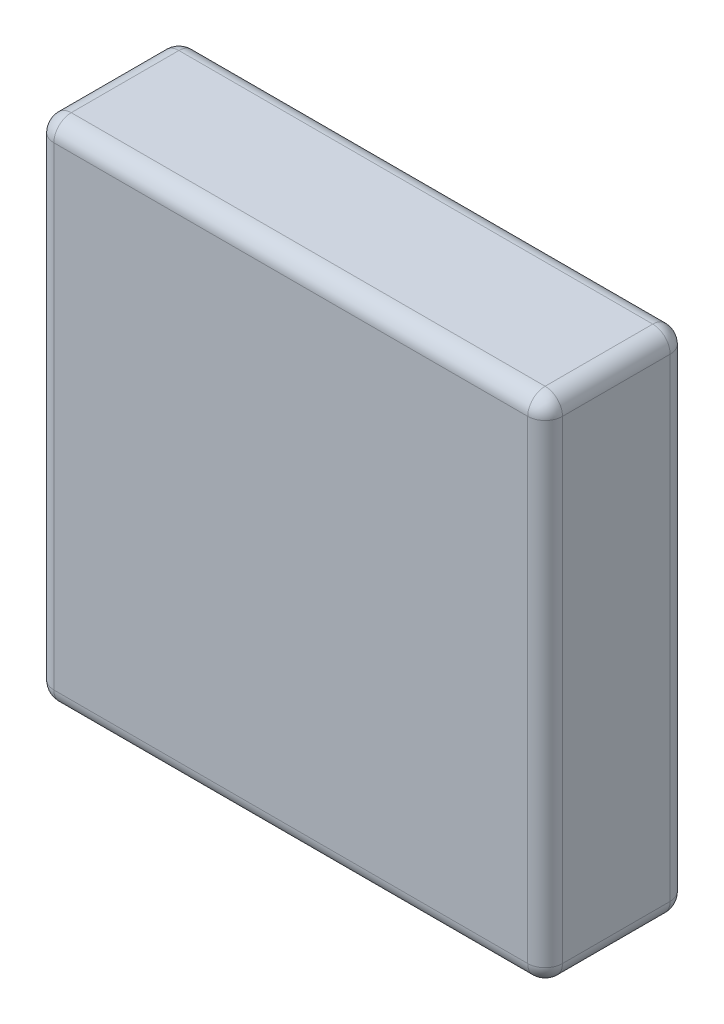
ISO-10303-21;
HEADER;
FILE_DESCRIPTION(('STEP AP214'),'2;1');
FILE_NAME('part.step','',(''),(''),'','','');
FILE_SCHEMA(('AUTOMOTIVE_DESIGN { 1 0 10303 214 1 1 1 1 }'));
ENDSEC;
DATA;
#1=APPLICATION_CONTEXT('core data for automotive mechanical design processes');
#2=APPLICATION_PROTOCOL_DEFINITION('international standard','automotive_design',2000,#1);
#3=PRODUCT_CONTEXT('',#1,'mechanical');
#4=PRODUCT('Part','Part','',(#3));
#5=PRODUCT_RELATED_PRODUCT_CATEGORY('part','',(#4));
#6=PRODUCT_DEFINITION_FORMATION('','',#4);
#7=PRODUCT_DEFINITION_CONTEXT('part definition',#1,'design');
#8=PRODUCT_DEFINITION('design','',#6,#7);
#9=PRODUCT_DEFINITION_SHAPE('','',#8);
#10=(LENGTH_UNIT() NAMED_UNIT(*) SI_UNIT(.MILLI.,.METRE.));
#11=(NAMED_UNIT(*) PLANE_ANGLE_UNIT() SI_UNIT($,.RADIAN.));
#12=(NAMED_UNIT(*) SI_UNIT($,.STERADIAN.) SOLID_ANGLE_UNIT());
#13=UNCERTAINTY_MEASURE_WITH_UNIT(LENGTH_MEASURE(1.E-05),#10,'distance_accuracy_value','');
#14=(GEOMETRIC_REPRESENTATION_CONTEXT(3) GLOBAL_UNCERTAINTY_ASSIGNED_CONTEXT((#13)) GLOBAL_UNIT_ASSIGNED_CONTEXT((#10,
#11,#12)) REPRESENTATION_CONTEXT('',''));
#15=CARTESIAN_POINT('',(0.,0.,0.));
#16=DIRECTION('',(0.,0.,1.));
#17=DIRECTION('',(1.,0.,0.));
#18=AXIS2_PLACEMENT_3D('',#15,#16,#17);
#19=CARTESIAN_POINT('',(5.08,143.51,36.5252));
#20=DIRECTION('',(0.707106781286411,0.707106781086684,0.));
#21=DIRECTION('',(-0.707106781086684,0.707106781286411,0.));
#22=AXIS2_PLACEMENT_3D('',#19,#20,#21);
#23=SPHERICAL_SURFACE('',#22,5.08);
#24=CARTESIAN_POINT('',(5.08,143.51,36.5252));
#25=DIRECTION('',(-1.,0.,0.));
#26=DIRECTION('',(0.,0.,1.));
#27=AXIS2_PLACEMENT_3D('',#24,#25,#26);
#28=CIRCLE('',#27,5.08);
#29=CARTESIAN_POINT('',(5.08,148.59,36.5252));
#30=VERTEX_POINT('',#29);
#31=CARTESIAN_POINT('',(5.08,143.51,41.6052));
#32=VERTEX_POINT('',#31);
#33=EDGE_CURVE('E106',#30,#32,#28,.F.);
#34=ORIENTED_EDGE('',*,*,#33,.F.);
#35=CARTESIAN_POINT('',(5.08,143.51,36.5252));
#36=DIRECTION('',(0.,0.,-1.));
#37=DIRECTION('',(-1.,0.,0.));
#38=AXIS2_PLACEMENT_3D('',#35,#36,#37);
#39=CIRCLE('',#38,5.08);
#40=CARTESIAN_POINT('',(0.,143.51,36.5252));
#41=VERTEX_POINT('',#40);
#42=EDGE_CURVE('E142',#41,#30,#39,.T.);
#43=ORIENTED_EDGE('',*,*,#42,.F.);
#44=CARTESIAN_POINT('',(5.08,143.51,36.5252));
#45=DIRECTION('',(0.,-1.,0.));
#46=DIRECTION('',(0.,0.,-1.));
#47=AXIS2_PLACEMENT_3D('',#44,#45,#46);
#48=CIRCLE('',#47,5.08);
#49=EDGE_CURVE('E110',#32,#41,#48,.T.);
#50=ORIENTED_EDGE('',*,*,#49,.F.);
#51=EDGE_LOOP('',(#34,#43,#50));
#52=FACE_BOUND('',#51,.T.);
#53=ADVANCED_FACE('F17',(#52),#23,.T.);
#54=CARTESIAN_POINT('',(5.08,5.08,36.5252));
#55=DIRECTION('',(-0.707106781086687,0.707106781286408,0.));
#56=DIRECTION('',(-0.707106781286408,-0.707106781086687,0.));
#57=AXIS2_PLACEMENT_3D('',#54,#55,#56);
#58=SPHERICAL_SURFACE('',#57,5.08);
#59=CARTESIAN_POINT('',(5.08,5.08,36.5252));
#60=DIRECTION('',(0.,-1.,0.));
#61=DIRECTION('',(0.,0.,-1.));
#62=AXIS2_PLACEMENT_3D('',#59,#60,#61);
#63=CIRCLE('',#62,5.08);
#64=CARTESIAN_POINT('',(0.,5.08,36.5252));
#65=VERTEX_POINT('',#64);
#66=CARTESIAN_POINT('',(5.08000000000001,5.08,41.6052));
#67=VERTEX_POINT('',#66);
#68=EDGE_CURVE('E136',#65,#67,#63,.F.);
#69=ORIENTED_EDGE('',*,*,#68,.F.);
#70=CARTESIAN_POINT('',(5.08,5.08,36.5252));
#71=DIRECTION('',(0.,0.,-1.));
#72=DIRECTION('',(-1.,0.,0.));
#73=AXIS2_PLACEMENT_3D('',#70,#71,#72);
#74=CIRCLE('',#73,5.08);
#75=CARTESIAN_POINT('',(5.08000000000001,0.,36.5252));
#76=VERTEX_POINT('',#75);
#77=EDGE_CURVE('E174',#76,#65,#74,.T.);
#78=ORIENTED_EDGE('',*,*,#77,.F.);
#79=CARTESIAN_POINT('',(5.08000000000002,5.08,36.5252));
#80=DIRECTION('',(1.,0.,0.));
#81=DIRECTION('',(0.,0.,-1.));
#82=AXIS2_PLACEMENT_3D('',#79,#80,#81);
#83=CIRCLE('',#82,5.08);
#84=EDGE_CURVE('E139',#67,#76,#83,.T.);
#85=ORIENTED_EDGE('',*,*,#84,.F.);
#86=EDGE_LOOP('',(#69,#78,#85));
#87=FACE_BOUND('',#86,.T.);
#88=ADVANCED_FACE('F177',(#87),#58,.T.);
#89=CARTESIAN_POINT('',(143.51,143.51,36.5252));
#90=DIRECTION('',(0.707106781086685,-0.70710678128641,0.));
#91=DIRECTION('',(0.70710678128641,0.707106781086685,0.));
#92=AXIS2_PLACEMENT_3D('',#89,#90,#91);
#93=SPHERICAL_SURFACE('',#92,5.08);
#94=CARTESIAN_POINT('',(143.51,143.51,36.5252));
#95=DIRECTION('',(0.,1.,0.));
#96=DIRECTION('',(0.,0.,1.));
#97=AXIS2_PLACEMENT_3D('',#94,#95,#96);
#98=CIRCLE('',#97,5.08);
#99=CARTESIAN_POINT('',(148.59,143.51,36.5252));
#100=VERTEX_POINT('',#99);
#101=CARTESIAN_POINT('',(143.51,143.51,41.6052));
#102=VERTEX_POINT('',#101);
#103=EDGE_CURVE('E121',#100,#102,#98,.F.);
#104=ORIENTED_EDGE('',*,*,#103,.F.);
#105=CARTESIAN_POINT('',(143.51,143.51,36.5252));
#106=DIRECTION('',(0.,0.,-1.));
#107=DIRECTION('',(-1.,0.,0.));
#108=AXIS2_PLACEMENT_3D('',#105,#106,#107);
#109=CIRCLE('',#108,5.08);
#110=CARTESIAN_POINT('',(143.51,148.59,36.5252));
#111=VERTEX_POINT('',#110);
#112=EDGE_CURVE('E132',#111,#100,#109,.T.);
#113=ORIENTED_EDGE('',*,*,#112,.F.);
#114=CARTESIAN_POINT('',(143.51,143.51,36.5252));
#115=DIRECTION('',(-1.,0.,0.));
#116=DIRECTION('',(0.,0.,1.));
#117=AXIS2_PLACEMENT_3D('',#114,#115,#116);
#118=CIRCLE('',#117,5.08);
#119=EDGE_CURVE('E21',#102,#111,#118,.T.);
#120=ORIENTED_EDGE('',*,*,#119,.F.);
#121=EDGE_LOOP('',(#104,#113,#120));
#122=FACE_BOUND('',#121,.T.);
#123=ADVANCED_FACE('F131',(#122),#93,.T.);
#124=CARTESIAN_POINT('',(0.,0.,41.6052));
#125=DIRECTION('',(0.,0.,1.));
#126=DIRECTION('',(1.,0.,0.));
#127=AXIS2_PLACEMENT_3D('',#124,#125,#126);
#128=PLANE('',#127);
#129=DIRECTION('',(-1.,0.,0.));
#130=VECTOR('',#129,1.);
#131=CARTESIAN_POINT('',(143.839384184966,143.51,41.6052));
#132=LINE('',#131,#130);
#133=EDGE_CURVE('E99',#32,#102,#132,.F.);
#134=ORIENTED_EDGE('',*,*,#133,.F.);
#135=DIRECTION('',(0.,-1.,0.));
#136=VECTOR('',#135,1.);
#137=CARTESIAN_POINT('',(5.08,143.839384184966,41.6052));
#138=LINE('',#137,#136);
#139=EDGE_CURVE('E138',#67,#32,#138,.F.);
#140=ORIENTED_EDGE('',*,*,#139,.F.);
#141=DIRECTION('',(1.,0.,0.));
#142=VECTOR('',#141,1.);
#143=CARTESIAN_POINT('',(4.75061581503384,5.08,41.6052));
#144=LINE('',#143,#142);
#145=CARTESIAN_POINT('',(143.51,5.08000000000001,41.6052));
#146=VERTEX_POINT('',#145);
#147=EDGE_CURVE('E118',#146,#67,#144,.F.);
#148=ORIENTED_EDGE('',*,*,#147,.F.);
#149=DIRECTION('',(0.,1.,0.));
#150=VECTOR('',#149,1.);
#151=CARTESIAN_POINT('',(143.51,4.75061581503384,41.6052));
#152=LINE('',#151,#150);
#153=EDGE_CURVE('E114',#102,#146,#152,.F.);
#154=ORIENTED_EDGE('',*,*,#153,.F.);
#155=EDGE_LOOP('',(#134,#140,#148,#154));
#156=FACE_BOUND('',#155,.T.);
#157=ADVANCED_FACE('F116',(#156),#128,.T.);
#158=CARTESIAN_POINT('',(143.51,5.08,36.5252));
#159=DIRECTION('',(-0.707106781286409,-0.707106781086686,0.));
#160=DIRECTION('',(0.707106781086686,-0.707106781286409,0.));
#161=AXIS2_PLACEMENT_3D('',#158,#159,#160);
#162=SPHERICAL_SURFACE('',#161,5.08);
#163=CARTESIAN_POINT('',(143.51,5.08,36.5252));
#164=DIRECTION('',(1.,0.,0.));
#165=DIRECTION('',(0.,0.,-1.));
#166=AXIS2_PLACEMENT_3D('',#163,#164,#165);
#167=CIRCLE('',#166,5.08);
#168=CARTESIAN_POINT('',(143.51,0.,36.5252));
#169=VERTEX_POINT('',#168);
#170=EDGE_CURVE('E141',#169,#146,#167,.F.);
#171=ORIENTED_EDGE('',*,*,#170,.F.);
#172=CARTESIAN_POINT('',(143.51,5.08,36.5252));
#173=DIRECTION('',(0.,0.,-1.));
#174=DIRECTION('',(-1.,0.,0.));
#175=AXIS2_PLACEMENT_3D('',#172,#173,#174);
#176=CIRCLE('',#175,5.08);
#177=CARTESIAN_POINT('',(148.59,5.08000000000001,36.5252));
#178=VERTEX_POINT('',#177);
#179=EDGE_CURVE('E120',#178,#169,#176,.T.);
#180=ORIENTED_EDGE('',*,*,#179,.F.);
#181=CARTESIAN_POINT('',(143.51,5.08000000000002,36.5252));
#182=DIRECTION('',(0.,1.,0.));
#183=DIRECTION('',(0.,0.,1.));
#184=AXIS2_PLACEMENT_3D('',#181,#182,#183);
#185=CIRCLE('',#184,5.08);
#186=EDGE_CURVE('E129',#146,#178,#185,.T.);
#187=ORIENTED_EDGE('',*,*,#186,.F.);
#188=EDGE_LOOP('',(#171,#180,#187));
#189=FACE_BOUND('',#188,.T.);
#190=ADVANCED_FACE('F190',(#189),#162,.T.);
#191=CARTESIAN_POINT('',(143.839384184966,143.51,36.5252));
#192=DIRECTION('',(-1.,0.,0.));
#193=DIRECTION('',(0.,0.,1.));
#194=AXIS2_PLACEMENT_3D('',#191,#192,#193);
#195=CYLINDRICAL_SURFACE('',#194,5.08);
#196=ORIENTED_EDGE('',*,*,#33,.T.);
#197=ORIENTED_EDGE('',*,*,#133,.T.);
#198=ORIENTED_EDGE('',*,*,#119,.T.);
#199=DIRECTION('',(1.,0.,0.));
#200=VECTOR('',#199,1.);
#201=CARTESIAN_POINT('',(148.59,148.59,36.5252));
#202=LINE('',#201,#200);
#203=EDGE_CURVE('E188',#30,#111,#202,.T.);
#204=ORIENTED_EDGE('',*,*,#203,.F.);
#205=EDGE_LOOP('',(#196,#197,#198,#204));
#206=FACE_BOUND('',#205,.T.);
#207=ADVANCED_FACE('F101',(#206),#195,.T.);
#208=CARTESIAN_POINT('',(5.08,143.839384184966,36.5252));
#209=DIRECTION('',(0.,-1.,0.));
#210=DIRECTION('',(0.,0.,-1.));
#211=AXIS2_PLACEMENT_3D('',#208,#209,#210);
#212=CYLINDRICAL_SURFACE('',#211,5.08);
#213=ORIENTED_EDGE('',*,*,#68,.T.);
#214=ORIENTED_EDGE('',*,*,#139,.T.);
#215=ORIENTED_EDGE('',*,*,#49,.T.);
#216=DIRECTION('',(0.,1.,0.));
#217=VECTOR('',#216,1.);
#218=CARTESIAN_POINT('',(0.,148.59,36.5252));
#219=LINE('',#218,#217);
#220=EDGE_CURVE('E245',#65,#41,#219,.T.);
#221=ORIENTED_EDGE('',*,*,#220,.F.);
#222=EDGE_LOOP('',(#213,#214,#215,#221));
#223=FACE_BOUND('',#222,.T.);
#224=ADVANCED_FACE('F196',(#223),#212,.T.);
#225=CARTESIAN_POINT('',(5.08,143.51,95.84173872));
#226=DIRECTION('',(0.,0.,-1.));
#227=DIRECTION('',(-1.,0.,0.));
#228=AXIS2_PLACEMENT_3D('',#225,#226,#227);
#229=CYLINDRICAL_SURFACE('',#228,5.08);
#230=DIRECTION('',(0.,0.,1.));
#231=VECTOR('',#230,1.);
#232=CARTESIAN_POINT('',(0.,143.51,0.));
#233=LINE('',#232,#231);
#234=CARTESIAN_POINT('',(0.,143.51,5.08));
#235=VERTEX_POINT('',#234);
#236=EDGE_CURVE('E248',#41,#235,#233,.F.);
#237=ORIENTED_EDGE('',*,*,#236,.F.);
#238=ORIENTED_EDGE('',*,*,#42,.T.);
#239=DIRECTION('',(0.,0.,1.));
#240=VECTOR('',#239,1.);
#241=CARTESIAN_POINT('',(5.08,148.59,0.));
#242=LINE('',#241,#240);
#243=CARTESIAN_POINT('',(5.08,148.59,5.08));
#244=VERTEX_POINT('',#243);
#245=EDGE_CURVE('E257',#244,#30,#242,.T.);
#246=ORIENTED_EDGE('',*,*,#245,.F.);
#247=CARTESIAN_POINT('',(5.08,143.51,5.08));
#248=DIRECTION('',(0.,0.,-1.));
#249=DIRECTION('',(-0.707106781086687,0.707106781286408,0.));
#250=AXIS2_PLACEMENT_3D('',#247,#248,#249);
#251=CIRCLE('',#250,5.08);
#252=EDGE_CURVE('E242',#235,#244,#251,.T.);
#253=ORIENTED_EDGE('',*,*,#252,.F.);
#254=EDGE_LOOP('',(#237,#238,#246,#253));
#255=FACE_BOUND('',#254,.T.);
#256=ADVANCED_FACE('F199',(#255),#229,.T.);
#257=CARTESIAN_POINT('',(4.75061581503384,5.08,36.5252));
#258=DIRECTION('',(1.,0.,0.));
#259=DIRECTION('',(0.,0.,-1.));
#260=AXIS2_PLACEMENT_3D('',#257,#258,#259);
#261=CYLINDRICAL_SURFACE('',#260,5.08);
#262=ORIENTED_EDGE('',*,*,#170,.T.);
#263=ORIENTED_EDGE('',*,*,#147,.T.);
#264=ORIENTED_EDGE('',*,*,#84,.T.);
#265=DIRECTION('',(1.,0.,0.));
#266=VECTOR('',#265,1.);
#267=CARTESIAN_POINT('',(0.,0.,36.5252));
#268=LINE('',#267,#266);
#269=EDGE_CURVE('E264',#169,#76,#268,.F.);
#270=ORIENTED_EDGE('',*,*,#269,.F.);
#271=EDGE_LOOP('',(#262,#263,#264,#270));
#272=FACE_BOUND('',#271,.T.);
#273=ADVANCED_FACE('F203',(#272),#261,.T.);
#274=CARTESIAN_POINT('',(5.08,5.08,95.84173872));
#275=DIRECTION('',(0.,0.,-1.));
#276=DIRECTION('',(-1.,0.,0.));
#277=AXIS2_PLACEMENT_3D('',#274,#275,#276);
#278=CYLINDRICAL_SURFACE('',#277,5.08);
#279=DIRECTION('',(0.,0.,-1.));
#280=VECTOR('',#279,1.);
#281=CARTESIAN_POINT('',(5.08,0.,0.));
#282=LINE('',#281,#280);
#283=CARTESIAN_POINT('',(5.07999999999999,0.,5.08));
#284=VERTEX_POINT('',#283);
#285=EDGE_CURVE('E244',#76,#284,#282,.T.);
#286=ORIENTED_EDGE('',*,*,#285,.F.);
#287=ORIENTED_EDGE('',*,*,#77,.T.);
#288=DIRECTION('',(0.,0.,1.));
#289=VECTOR('',#288,1.);
#290=CARTESIAN_POINT('',(0.,5.08,0.));
#291=LINE('',#290,#289);
#292=CARTESIAN_POINT('',(0.,5.08,5.08));
#293=VERTEX_POINT('',#292);
#294=EDGE_CURVE('E250',#293,#65,#291,.T.);
#295=ORIENTED_EDGE('',*,*,#294,.F.);
#296=CARTESIAN_POINT('',(5.08,5.08,5.08));
#297=DIRECTION('',(0.,0.,-1.));
#298=DIRECTION('',(-0.707106781286408,-0.707106781086687,0.));
#299=AXIS2_PLACEMENT_3D('',#296,#297,#298);
#300=CIRCLE('',#299,5.08);
#301=EDGE_CURVE('E267',#284,#293,#300,.T.);
#302=ORIENTED_EDGE('',*,*,#301,.F.);
#303=EDGE_LOOP('',(#286,#287,#295,#302));
#304=FACE_BOUND('',#303,.T.);
#305=ADVANCED_FACE('F207',(#304),#278,.T.);
#306=CARTESIAN_POINT('',(143.51,143.51,95.84173872));
#307=DIRECTION('',(0.,0.,-1.));
#308=DIRECTION('',(-1.,0.,0.));
#309=AXIS2_PLACEMENT_3D('',#306,#307,#308);
#310=CYLINDRICAL_SURFACE('',#309,5.08);
#311=DIRECTION('',(0.,0.,1.));
#312=VECTOR('',#311,1.);
#313=CARTESIAN_POINT('',(143.51,148.59,0.));
#314=LINE('',#313,#312);
#315=CARTESIAN_POINT('',(143.51,148.59,5.08));
#316=VERTEX_POINT('',#315);
#317=EDGE_CURVE('E255',#111,#316,#314,.F.);
#318=ORIENTED_EDGE('',*,*,#317,.F.);
#319=ORIENTED_EDGE('',*,*,#112,.T.);
#320=DIRECTION('',(0.,0.,-1.));
#321=VECTOR('',#320,1.);
#322=CARTESIAN_POINT('',(148.59,143.51,0.));
#323=LINE('',#322,#321);
#324=CARTESIAN_POINT('',(148.59,143.51,5.08));
#325=VERTEX_POINT('',#324);
#326=EDGE_CURVE('E262',#325,#100,#323,.F.);
#327=ORIENTED_EDGE('',*,*,#326,.F.);
#328=CARTESIAN_POINT('',(143.51,143.51,5.08));
#329=DIRECTION('',(0.,0.,-1.));
#330=DIRECTION('',(0.707106781286405,0.70710678108669,0.));
#331=AXIS2_PLACEMENT_3D('',#328,#329,#330);
#332=CIRCLE('',#331,5.08);
#333=EDGE_CURVE('E296',#316,#325,#332,.T.);
#334=ORIENTED_EDGE('',*,*,#333,.F.);
#335=EDGE_LOOP('',(#318,#319,#327,#334));
#336=FACE_BOUND('',#335,.T.);
#337=ADVANCED_FACE('F211',(#336),#310,.T.);
#338=CARTESIAN_POINT('',(143.51,4.75061581503384,36.5252));
#339=DIRECTION('',(0.,1.,0.));
#340=DIRECTION('',(0.,0.,1.));
#341=AXIS2_PLACEMENT_3D('',#338,#339,#340);
#342=CYLINDRICAL_SURFACE('',#341,5.08);
#343=ORIENTED_EDGE('',*,*,#103,.T.);
#344=ORIENTED_EDGE('',*,*,#153,.T.);
#345=ORIENTED_EDGE('',*,*,#186,.T.);
#346=DIRECTION('',(0.,1.,0.));
#347=VECTOR('',#346,1.);
#348=CARTESIAN_POINT('',(148.59,0.,36.5252));
#349=LINE('',#348,#347);
#350=EDGE_CURVE('E127',#100,#178,#349,.F.);
#351=ORIENTED_EDGE('',*,*,#350,.F.);
#352=EDGE_LOOP('',(#343,#344,#345,#351));
#353=FACE_BOUND('',#352,.T.);
#354=ADVANCED_FACE('F125',(#353),#342,.T.);
#355=CARTESIAN_POINT('',(143.51,5.08,95.84173872));
#356=DIRECTION('',(0.,0.,-1.));
#357=DIRECTION('',(-1.,0.,0.));
#358=AXIS2_PLACEMENT_3D('',#355,#356,#357);
#359=CYLINDRICAL_SURFACE('',#358,5.08);
#360=DIRECTION('',(0.,0.,-1.));
#361=VECTOR('',#360,1.);
#362=CARTESIAN_POINT('',(148.59,5.08,0.));
#363=LINE('',#362,#361);
#364=CARTESIAN_POINT('',(148.59,5.07999999999999,5.08));
#365=VERTEX_POINT('',#364);
#366=EDGE_CURVE('E293',#178,#365,#363,.T.);
#367=ORIENTED_EDGE('',*,*,#366,.F.);
#368=ORIENTED_EDGE('',*,*,#179,.T.);
#369=DIRECTION('',(0.,0.,-1.));
#370=VECTOR('',#369,1.);
#371=CARTESIAN_POINT('',(143.51,0.,0.));
#372=LINE('',#371,#370);
#373=CARTESIAN_POINT('',(143.51,0.,5.08));
#374=VERTEX_POINT('',#373);
#375=EDGE_CURVE('E240',#374,#169,#372,.F.);
#376=ORIENTED_EDGE('',*,*,#375,.F.);
#377=CARTESIAN_POINT('',(143.51,5.08,5.08));
#378=DIRECTION('',(0.,0.,-1.));
#379=DIRECTION('',(0.707106781086688,-0.707106781286407,0.));
#380=AXIS2_PLACEMENT_3D('',#377,#378,#379);
#381=CIRCLE('',#380,5.08);
#382=EDGE_CURVE('E149',#365,#374,#381,.T.);
#383=ORIENTED_EDGE('',*,*,#382,.F.);
#384=EDGE_LOOP('',(#367,#368,#376,#383));
#385=FACE_BOUND('',#384,.T.);
#386=ADVANCED_FACE('F218',(#385),#359,.T.);
#387=CARTESIAN_POINT('',(148.59,148.59,0.));
#388=DIRECTION('',(0.,1.,0.));
#389=DIRECTION('',(0.,0.,1.));
#390=AXIS2_PLACEMENT_3D('',#387,#388,#389);
#391=PLANE('',#390);
#392=ORIENTED_EDGE('',*,*,#245,.T.);
#393=ORIENTED_EDGE('',*,*,#203,.T.);
#394=ORIENTED_EDGE('',*,*,#317,.T.);
#395=DIRECTION('',(1.,0.,0.));
#396=VECTOR('',#395,1.);
#397=CARTESIAN_POINT('',(4.61209143757307,148.59,5.08));
#398=LINE('',#397,#396);
#399=EDGE_CURVE('E148',#244,#316,#398,.T.);
#400=ORIENTED_EDGE('',*,*,#399,.F.);
#401=EDGE_LOOP('',(#392,#393,#394,#400));
#402=FACE_BOUND('',#401,.T.);
#403=ADVANCED_FACE('F221',(#402),#391,.T.);
#404=CARTESIAN_POINT('',(0.,148.59,0.));
#405=DIRECTION('',(-1.,0.,0.));
#406=DIRECTION('',(0.,0.,1.));
#407=AXIS2_PLACEMENT_3D('',#404,#405,#406);
#408=PLANE('',#407);
#409=ORIENTED_EDGE('',*,*,#294,.T.);
#410=ORIENTED_EDGE('',*,*,#220,.T.);
#411=ORIENTED_EDGE('',*,*,#236,.T.);
#412=DIRECTION('',(0.,1.,0.));
#413=VECTOR('',#412,1.);
#414=CARTESIAN_POINT('',(0.,4.61209143757307,5.08));
#415=LINE('',#414,#413);
#416=EDGE_CURVE('E155',#293,#235,#415,.T.);
#417=ORIENTED_EDGE('',*,*,#416,.F.);
#418=EDGE_LOOP('',(#409,#410,#411,#417));
#419=FACE_BOUND('',#418,.T.);
#420=ADVANCED_FACE('F225',(#419),#408,.T.);
#421=CARTESIAN_POINT('',(5.08,143.51,5.08));
#422=DIRECTION('',(-0.707106781286408,-0.707106781086687,0.));
#423=DIRECTION('',(-0.707106781086687,0.707106781286408,0.));
#424=AXIS2_PLACEMENT_3D('',#421,#422,#423);
#425=SPHERICAL_SURFACE('',#424,5.08);
#426=CARTESIAN_POINT('',(5.08,143.51,5.08));
#427=DIRECTION('',(0.,1.,0.));
#428=DIRECTION('',(0.,0.,1.));
#429=AXIS2_PLACEMENT_3D('',#426,#427,#428);
#430=CIRCLE('',#429,5.08);
#431=CARTESIAN_POINT('',(5.08,143.51,0.));
#432=VERTEX_POINT('',#431);
#433=EDGE_CURVE('E156',#235,#432,#430,.F.);
#434=ORIENTED_EDGE('',*,*,#433,.F.);
#435=ORIENTED_EDGE('',*,*,#252,.T.);
#436=CARTESIAN_POINT('',(5.08,143.51,5.08));
#437=DIRECTION('',(1.,0.,0.));
#438=DIRECTION('',(0.,0.,-1.));
#439=AXIS2_PLACEMENT_3D('',#436,#437,#438);
#440=CIRCLE('',#439,5.08);
#441=EDGE_CURVE('E145',#432,#244,#440,.T.);
#442=ORIENTED_EDGE('',*,*,#441,.F.);
#443=EDGE_LOOP('',(#434,#435,#442));
#444=FACE_BOUND('',#443,.T.);
#445=ADVANCED_FACE('F229',(#444),#425,.T.);
#446=CARTESIAN_POINT('',(0.,0.,0.));
#447=DIRECTION('',(0.,-1.,0.));
#448=DIRECTION('',(0.,0.,-1.));
#449=AXIS2_PLACEMENT_3D('',#446,#447,#448);
#450=PLANE('',#449);
#451=ORIENTED_EDGE('',*,*,#375,.T.);
#452=ORIENTED_EDGE('',*,*,#269,.T.);
#453=ORIENTED_EDGE('',*,*,#285,.T.);
#454=DIRECTION('',(-1.,0.,0.));
#455=VECTOR('',#454,1.);
#456=CARTESIAN_POINT('',(143.977908562427,0.,5.08));
#457=LINE('',#456,#455);
#458=EDGE_CURVE('E161',#374,#284,#457,.T.);
#459=ORIENTED_EDGE('',*,*,#458,.F.);
#460=EDGE_LOOP('',(#451,#452,#453,#459));
#461=FACE_BOUND('',#460,.T.);
#462=ADVANCED_FACE('F234',(#461),#450,.T.);
#463=CARTESIAN_POINT('',(5.08,5.08,5.08));
#464=DIRECTION('',(0.707106781086686,-0.707106781286409,0.));
#465=DIRECTION('',(-0.707106781286409,-0.707106781086686,0.));
#466=AXIS2_PLACEMENT_3D('',#463,#464,#465);
#467=SPHERICAL_SURFACE('',#466,5.08);
#468=CARTESIAN_POINT('',(5.07999999999997,5.08,5.08));
#469=DIRECTION('',(-1.,0.,0.));
#470=DIRECTION('',(0.,0.,1.));
#471=AXIS2_PLACEMENT_3D('',#468,#469,#470);
#472=CIRCLE('',#471,5.08);
#473=CARTESIAN_POINT('',(5.07999999999999,5.08,0.));
#474=VERTEX_POINT('',#473);
#475=EDGE_CURVE('E162',#284,#474,#472,.F.);
#476=ORIENTED_EDGE('',*,*,#475,.F.);
#477=ORIENTED_EDGE('',*,*,#301,.T.);
#478=CARTESIAN_POINT('',(5.08,5.08,5.08));
#479=DIRECTION('',(0.,1.,0.));
#480=DIRECTION('',(0.,0.,1.));
#481=AXIS2_PLACEMENT_3D('',#478,#479,#480);
#482=CIRCLE('',#481,5.08);
#483=EDGE_CURVE('E152',#474,#293,#482,.T.);
#484=ORIENTED_EDGE('',*,*,#483,.F.);
#485=EDGE_LOOP('',(#476,#477,#484));
#486=FACE_BOUND('',#485,.T.);
#487=ADVANCED_FACE('F309',(#486),#467,.T.);
#488=CARTESIAN_POINT('',(143.51,143.51,5.08));
#489=DIRECTION('',(-0.70710678108669,0.707106781286405,0.));
#490=DIRECTION('',(0.707106781286405,0.70710678108669,0.));
#491=AXIS2_PLACEMENT_3D('',#488,#489,#490);
#492=SPHERICAL_SURFACE('',#491,5.08);
#493=CARTESIAN_POINT('',(143.51,143.51,5.08));
#494=DIRECTION('',(1.,0.,0.));
#495=DIRECTION('',(0.,0.,-1.));
#496=AXIS2_PLACEMENT_3D('',#493,#494,#495);
#497=CIRCLE('',#496,5.08);
#498=CARTESIAN_POINT('',(143.51,143.51,0.));
#499=VERTEX_POINT('',#498);
#500=EDGE_CURVE('E150',#316,#499,#497,.F.);
#501=ORIENTED_EDGE('',*,*,#500,.F.);
#502=ORIENTED_EDGE('',*,*,#333,.T.);
#503=CARTESIAN_POINT('',(143.51,143.51,5.08));
#504=DIRECTION('',(0.,-1.,0.));
#505=DIRECTION('',(0.,0.,-1.));
#506=AXIS2_PLACEMENT_3D('',#503,#504,#505);
#507=CIRCLE('',#506,5.08);
#508=EDGE_CURVE('E164',#499,#325,#507,.T.);
#509=ORIENTED_EDGE('',*,*,#508,.F.);
#510=EDGE_LOOP('',(#501,#502,#509));
#511=FACE_BOUND('',#510,.T.);
#512=ADVANCED_FACE('F306',(#511),#492,.T.);
#513=CARTESIAN_POINT('',(148.59,0.,0.));
#514=DIRECTION('',(1.,0.,0.));
#515=DIRECTION('',(0.,0.,-1.));
#516=AXIS2_PLACEMENT_3D('',#513,#514,#515);
#517=PLANE('',#516);
#518=ORIENTED_EDGE('',*,*,#326,.T.);
#519=ORIENTED_EDGE('',*,*,#350,.T.);
#520=ORIENTED_EDGE('',*,*,#366,.T.);
#521=DIRECTION('',(0.,-1.,0.));
#522=VECTOR('',#521,1.);
#523=CARTESIAN_POINT('',(148.59,143.977908562427,5.08));
#524=LINE('',#523,#522);
#525=EDGE_CURVE('E167',#325,#365,#524,.T.);
#526=ORIENTED_EDGE('',*,*,#525,.F.);
#527=EDGE_LOOP('',(#518,#519,#520,#526));
#528=FACE_BOUND('',#527,.T.);
#529=ADVANCED_FACE('F291',(#528),#517,.T.);
#530=CARTESIAN_POINT('',(143.51,5.08,5.08));
#531=DIRECTION('',(0.707106781286408,0.707106781086687,0.));
#532=DIRECTION('',(0.707106781086687,-0.707106781286408,0.));
#533=AXIS2_PLACEMENT_3D('',#530,#531,#532);
#534=SPHERICAL_SURFACE('',#533,5.08);
#535=CARTESIAN_POINT('',(143.51,5.07999999999997,5.08));
#536=DIRECTION('',(0.,-1.,0.));
#537=DIRECTION('',(0.,0.,-1.));
#538=AXIS2_PLACEMENT_3D('',#535,#536,#537);
#539=CIRCLE('',#538,5.08);
#540=CARTESIAN_POINT('',(143.51,5.07999999999999,0.));
#541=VERTEX_POINT('',#540);
#542=EDGE_CURVE('E35',#365,#541,#539,.F.);
#543=ORIENTED_EDGE('',*,*,#542,.F.);
#544=ORIENTED_EDGE('',*,*,#382,.T.);
#545=CARTESIAN_POINT('',(143.51,5.08,5.08));
#546=DIRECTION('',(-1.,0.,0.));
#547=DIRECTION('',(0.,0.,1.));
#548=AXIS2_PLACEMENT_3D('',#545,#546,#547);
#549=CIRCLE('',#548,5.08);
#550=EDGE_CURVE('E158',#541,#374,#549,.T.);
#551=ORIENTED_EDGE('',*,*,#550,.F.);
#552=EDGE_LOOP('',(#543,#544,#551));
#553=FACE_BOUND('',#552,.T.);
#554=ADVANCED_FACE('F365',(#553),#534,.T.);
#555=CARTESIAN_POINT('',(4.61209143757307,143.51,5.08));
#556=DIRECTION('',(1.,0.,0.));
#557=DIRECTION('',(0.,0.,-1.));
#558=AXIS2_PLACEMENT_3D('',#555,#556,#557);
#559=CYLINDRICAL_SURFACE('',#558,5.08);
#560=ORIENTED_EDGE('',*,*,#500,.T.);
#561=DIRECTION('',(1.,0.,0.));
#562=VECTOR('',#561,1.);
#563=CARTESIAN_POINT('',(0.,143.51,0.));
#564=LINE('',#563,#562);
#565=EDGE_CURVE('E168',#499,#432,#564,.F.);
#566=ORIENTED_EDGE('',*,*,#565,.T.);
#567=ORIENTED_EDGE('',*,*,#441,.T.);
#568=ORIENTED_EDGE('',*,*,#399,.T.);
#569=EDGE_LOOP('',(#560,#566,#567,#568));
#570=FACE_BOUND('',#569,.T.);
#571=ADVANCED_FACE('F347',(#570),#559,.T.);
#572=CARTESIAN_POINT('',(5.08,4.61209143757307,5.08));
#573=DIRECTION('',(0.,1.,0.));
#574=DIRECTION('',(0.,0.,1.));
#575=AXIS2_PLACEMENT_3D('',#572,#573,#574);
#576=CYLINDRICAL_SURFACE('',#575,5.08);
#577=ORIENTED_EDGE('',*,*,#433,.T.);
#578=DIRECTION('',(0.,1.,0.));
#579=VECTOR('',#578,1.);
#580=CARTESIAN_POINT('',(5.08,0.,0.));
#581=LINE('',#580,#579);
#582=EDGE_CURVE('E320',#432,#474,#581,.F.);
#583=ORIENTED_EDGE('',*,*,#582,.T.);
#584=ORIENTED_EDGE('',*,*,#483,.T.);
#585=ORIENTED_EDGE('',*,*,#416,.T.);
#586=EDGE_LOOP('',(#577,#583,#584,#585));
#587=FACE_BOUND('',#586,.T.);
#588=ADVANCED_FACE('F343',(#587),#576,.T.);
#589=CARTESIAN_POINT('',(143.977908562427,5.08,5.08));
#590=DIRECTION('',(-1.,0.,0.));
#591=DIRECTION('',(0.,0.,1.));
#592=AXIS2_PLACEMENT_3D('',#589,#590,#591);
#593=CYLINDRICAL_SURFACE('',#592,5.08);
#594=ORIENTED_EDGE('',*,*,#475,.T.);
#595=DIRECTION('',(1.,0.,0.));
#596=VECTOR('',#595,1.);
#597=CARTESIAN_POINT('',(0.,5.08,0.));
#598=LINE('',#597,#596);
#599=EDGE_CURVE('E27',#474,#541,#598,.T.);
#600=ORIENTED_EDGE('',*,*,#599,.T.);
#601=ORIENTED_EDGE('',*,*,#550,.T.);
#602=ORIENTED_EDGE('',*,*,#458,.T.);
#603=EDGE_LOOP('',(#594,#600,#601,#602));
#604=FACE_BOUND('',#603,.T.);
#605=ADVANCED_FACE('F328',(#604),#593,.T.);
#606=CARTESIAN_POINT('',(143.51,143.977908562427,5.08));
#607=DIRECTION('',(0.,-1.,0.));
#608=DIRECTION('',(0.,0.,-1.));
#609=AXIS2_PLACEMENT_3D('',#606,#607,#608);
#610=CYLINDRICAL_SURFACE('',#609,5.08);
#611=ORIENTED_EDGE('',*,*,#542,.T.);
#612=DIRECTION('',(0.,1.,0.));
#613=VECTOR('',#612,1.);
#614=CARTESIAN_POINT('',(143.51,0.,0.));
#615=LINE('',#614,#613);
#616=EDGE_CURVE('E11',#541,#499,#615,.T.);
#617=ORIENTED_EDGE('',*,*,#616,.T.);
#618=ORIENTED_EDGE('',*,*,#508,.T.);
#619=ORIENTED_EDGE('',*,*,#525,.T.);
#620=EDGE_LOOP('',(#611,#617,#618,#619));
#621=FACE_BOUND('',#620,.T.);
#622=ADVANCED_FACE('F351',(#621),#610,.T.);
#623=CARTESIAN_POINT('',(0.,0.,0.));
#624=DIRECTION('',(0.,0.,1.));
#625=DIRECTION('',(1.,0.,0.));
#626=AXIS2_PLACEMENT_3D('',#623,#624,#625);
#627=PLANE('',#626);
#628=ORIENTED_EDGE('',*,*,#599,.F.);
#629=ORIENTED_EDGE('',*,*,#582,.F.);
#630=ORIENTED_EDGE('',*,*,#565,.F.);
#631=ORIENTED_EDGE('',*,*,#616,.F.);
#632=EDGE_LOOP('',(#628,#629,#630,#631));
#633=FACE_BOUND('',#632,.T.);
#634=ADVANCED_FACE('F340',(#633),#627,.F.);
#635=CLOSED_SHELL('',(#53,#88,#123,#157,#190,#207,#224,#256,#273,#305,#337,#354,#386,#403,#420,
#445,#462,#487,#512,#529,#554,#571,#588,#605,#622,#634));
#636=MANIFOLD_SOLID_BREP('B1',#635);
#637=ADVANCED_BREP_SHAPE_REPRESENTATION('',(#18,#636),#14);
#638=SHAPE_DEFINITION_REPRESENTATION(#9,#637);
ENDSEC;
END-ISO-10303-21;
